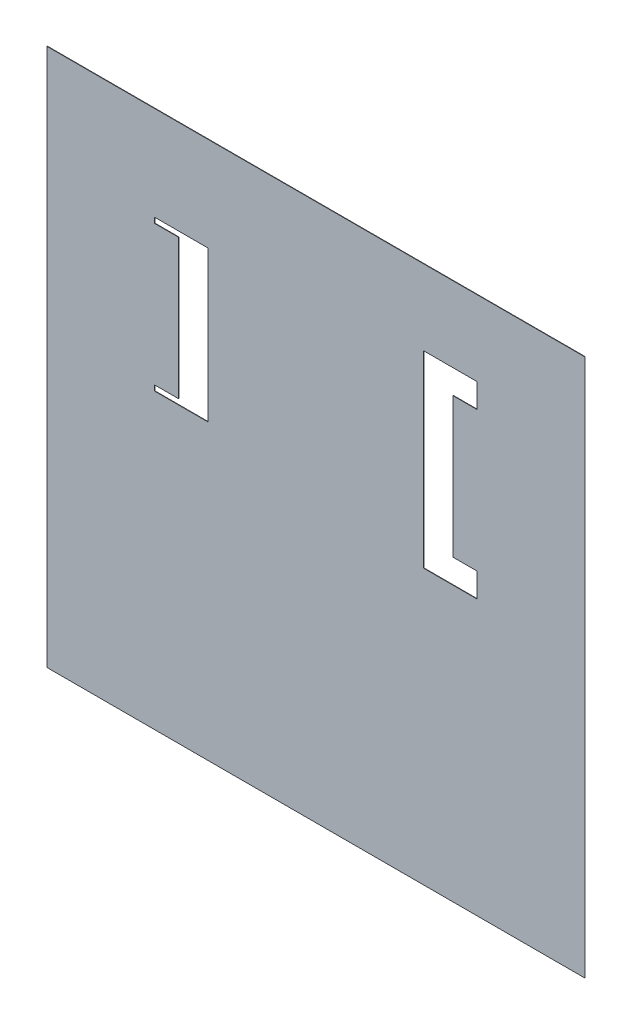
ISO-10303-21;
HEADER;
FILE_DESCRIPTION(('STEP AP214'),'2;1');
FILE_NAME('part.step','',(''),(''),'','','');
FILE_SCHEMA(('AUTOMOTIVE_DESIGN { 1 0 10303 214 1 1 1 1 }'));
ENDSEC;
DATA;
#1=APPLICATION_CONTEXT('core data for automotive mechanical design processes');
#2=APPLICATION_PROTOCOL_DEFINITION('international standard','automotive_design',2000,#1);
#3=PRODUCT_CONTEXT('',#1,'mechanical');
#4=PRODUCT('Part','Part','',(#3));
#5=PRODUCT_RELATED_PRODUCT_CATEGORY('part','',(#4));
#6=PRODUCT_DEFINITION_FORMATION('','',#4);
#7=PRODUCT_DEFINITION_CONTEXT('part definition',#1,'design');
#8=PRODUCT_DEFINITION('design','',#6,#7);
#9=PRODUCT_DEFINITION_SHAPE('','',#8);
#10=(LENGTH_UNIT() NAMED_UNIT(*) SI_UNIT(.MILLI.,.METRE.));
#11=(NAMED_UNIT(*) PLANE_ANGLE_UNIT() SI_UNIT($,.RADIAN.));
#12=(NAMED_UNIT(*) SI_UNIT($,.STERADIAN.) SOLID_ANGLE_UNIT());
#13=UNCERTAINTY_MEASURE_WITH_UNIT(LENGTH_MEASURE(1.E-05),#10,'distance_accuracy_value','');
#14=(GEOMETRIC_REPRESENTATION_CONTEXT(3) GLOBAL_UNCERTAINTY_ASSIGNED_CONTEXT((#13)) GLOBAL_UNIT_ASSIGNED_CONTEXT((#10,
#11,#12)) REPRESENTATION_CONTEXT('',''));
#15=CARTESIAN_POINT('',(0.,0.,0.));
#16=DIRECTION('',(0.,0.,1.));
#17=DIRECTION('',(1.,0.,0.));
#18=AXIS2_PLACEMENT_3D('',#15,#16,#17);
#19=CARTESIAN_POINT('',(0.,0.,0.02032));
#20=DIRECTION('',(1.,0.,0.));
#21=DIRECTION('',(0.,0.,-1.));
#22=AXIS2_PLACEMENT_3D('',#19,#20,#21);
#23=PLANE('',#22);
#24=DIRECTION('',(0.,-1.,0.));
#25=VECTOR('',#24,1.);
#26=CARTESIAN_POINT('',(0.,0.,0.));
#27=LINE('',#26,#25);
#28=CARTESIAN_POINT('',(0.,25.4,0.));
#29=VERTEX_POINT('',#28);
#30=CARTESIAN_POINT('',(0.,0.,0.));
#31=VERTEX_POINT('',#30);
#32=EDGE_CURVE('E314',#29,#31,#27,.T.);
#33=ORIENTED_EDGE('',*,*,#32,.T.);
#34=DIRECTION('',(0.,0.,-1.));
#35=VECTOR('',#34,1.);
#36=CARTESIAN_POINT('',(0.,0.,0.02032));
#37=LINE('',#36,#35);
#38=CARTESIAN_POINT('',(0.,0.,0.02032));
#39=VERTEX_POINT('',#38);
#40=EDGE_CURVE('E11',#39,#31,#37,.T.);
#41=ORIENTED_EDGE('',*,*,#40,.F.);
#42=DIRECTION('',(0.,-1.,0.));
#43=VECTOR('',#42,1.);
#44=CARTESIAN_POINT('',(0.,0.,0.02032));
#45=LINE('',#44,#43);
#46=CARTESIAN_POINT('',(0.,25.4,0.02032));
#47=VERTEX_POINT('',#46);
#48=EDGE_CURVE('E315',#47,#39,#45,.T.);
#49=ORIENTED_EDGE('',*,*,#48,.F.);
#50=DIRECTION('',(0.,0.,-1.));
#51=VECTOR('',#50,1.);
#52=CARTESIAN_POINT('',(0.,25.4,0.02032));
#53=LINE('',#52,#51);
#54=EDGE_CURVE('E325',#47,#29,#53,.T.);
#55=ORIENTED_EDGE('',*,*,#54,.T.);
#56=EDGE_LOOP('',(#33,#41,#49,#55));
#57=FACE_BOUND('',#56,.T.);
#58=ADVANCED_FACE('F33',(#57),#23,.F.);
#59=CARTESIAN_POINT('',(0.,0.,0.02032));
#60=DIRECTION('',(0.,1.,0.));
#61=DIRECTION('',(0.,0.,1.));
#62=AXIS2_PLACEMENT_3D('',#59,#60,#61);
#63=PLANE('',#62);
#64=DIRECTION('',(1.,0.,0.));
#65=VECTOR('',#64,1.);
#66=CARTESIAN_POINT('',(0.,0.,0.));
#67=LINE('',#66,#65);
#68=CARTESIAN_POINT('',(25.4,0.,0.));
#69=VERTEX_POINT('',#68);
#70=EDGE_CURVE('E328',#31,#69,#67,.T.);
#71=ORIENTED_EDGE('',*,*,#70,.T.);
#72=DIRECTION('',(0.,0.,-1.));
#73=VECTOR('',#72,1.);
#74=CARTESIAN_POINT('',(25.4,0.,0.02032));
#75=LINE('',#74,#73);
#76=CARTESIAN_POINT('',(25.4,0.,0.02032));
#77=VERTEX_POINT('',#76);
#78=EDGE_CURVE('E40',#77,#69,#75,.T.);
#79=ORIENTED_EDGE('',*,*,#78,.F.);
#80=DIRECTION('',(1.,0.,0.));
#81=VECTOR('',#80,1.);
#82=CARTESIAN_POINT('',(0.,0.,0.02032));
#83=LINE('',#82,#81);
#84=EDGE_CURVE('E318',#39,#77,#83,.T.);
#85=ORIENTED_EDGE('',*,*,#84,.F.);
#86=ORIENTED_EDGE('',*,*,#40,.T.);
#87=EDGE_LOOP('',(#71,#79,#85,#86));
#88=FACE_BOUND('',#87,.T.);
#89=ADVANCED_FACE('F357',(#88),#63,.F.);
#90=CARTESIAN_POINT('',(25.4,0.,0.02032));
#91=DIRECTION('',(-1.,0.,0.));
#92=DIRECTION('',(0.,0.,1.));
#93=AXIS2_PLACEMENT_3D('',#90,#91,#92);
#94=PLANE('',#93);
#95=DIRECTION('',(0.,1.,0.));
#96=VECTOR('',#95,1.);
#97=CARTESIAN_POINT('',(25.4,0.,0.));
#98=LINE('',#97,#96);
#99=CARTESIAN_POINT('',(25.4,25.4,0.));
#100=VERTEX_POINT('',#99);
#101=EDGE_CURVE('E330',#69,#100,#98,.T.);
#102=ORIENTED_EDGE('',*,*,#101,.T.);
#103=DIRECTION('',(0.,0.,-1.));
#104=VECTOR('',#103,1.);
#105=CARTESIAN_POINT('',(25.4,25.4,0.02032));
#106=LINE('',#105,#104);
#107=CARTESIAN_POINT('',(25.4,25.4,0.02032));
#108=VERTEX_POINT('',#107);
#109=EDGE_CURVE('E335',#108,#100,#106,.T.);
#110=ORIENTED_EDGE('',*,*,#109,.F.);
#111=DIRECTION('',(0.,1.,0.));
#112=VECTOR('',#111,1.);
#113=CARTESIAN_POINT('',(25.4,0.,0.02032));
#114=LINE('',#113,#112);
#115=EDGE_CURVE('E321',#77,#108,#114,.T.);
#116=ORIENTED_EDGE('',*,*,#115,.F.);
#117=ORIENTED_EDGE('',*,*,#78,.T.);
#118=EDGE_LOOP('',(#102,#110,#116,#117));
#119=FACE_BOUND('',#118,.T.);
#120=ADVANCED_FACE('F342',(#119),#94,.F.);
#121=CARTESIAN_POINT('',(0.,25.4,0.02032));
#122=DIRECTION('',(0.,-1.,0.));
#123=DIRECTION('',(0.,0.,-1.));
#124=AXIS2_PLACEMENT_3D('',#121,#122,#123);
#125=PLANE('',#124);
#126=DIRECTION('',(-1.,0.,0.));
#127=VECTOR('',#126,1.);
#128=CARTESIAN_POINT('',(0.,25.4,0.));
#129=LINE('',#128,#127);
#130=EDGE_CURVE('E319',#100,#29,#129,.T.);
#131=ORIENTED_EDGE('',*,*,#130,.T.);
#132=ORIENTED_EDGE('',*,*,#54,.F.);
#133=DIRECTION('',(-1.,0.,0.));
#134=VECTOR('',#133,1.);
#135=CARTESIAN_POINT('',(0.,25.4,0.02032));
#136=LINE('',#135,#134);
#137=EDGE_CURVE('E323',#108,#47,#136,.T.);
#138=ORIENTED_EDGE('',*,*,#137,.F.);
#139=ORIENTED_EDGE('',*,*,#109,.T.);
#140=EDGE_LOOP('',(#131,#132,#138,#139));
#141=FACE_BOUND('',#140,.T.);
#142=ADVANCED_FACE('F350',(#141),#125,.F.);
#143=CARTESIAN_POINT('',(0.,0.,0.02032));
#144=DIRECTION('',(0.,0.,-1.));
#145=DIRECTION('',(-1.,0.,0.));
#146=AXIS2_PLACEMENT_3D('',#143,#144,#145);
#147=PLANE('',#146);
#148=DIRECTION('',(-1.,0.,0.));
#149=VECTOR('',#148,1.);
#150=CARTESIAN_POINT('',(0.,12.954,0.02032));
#151=LINE('',#150,#149);
#152=CARTESIAN_POINT('',(20.32,12.954,0.02032));
#153=VERTEX_POINT('',#152);
#154=CARTESIAN_POINT('',(17.78,12.954,0.02032));
#155=VERTEX_POINT('',#154);
#156=EDGE_CURVE('E206',#153,#155,#151,.T.);
#157=ORIENTED_EDGE('',*,*,#156,.T.);
#158=DIRECTION('',(0.,1.,0.));
#159=VECTOR('',#158,1.);
#160=CARTESIAN_POINT('',(17.78,0.,0.02032));
#161=LINE('',#160,#159);
#162=CARTESIAN_POINT('',(17.78,21.844,0.02032));
#163=VERTEX_POINT('',#162);
#164=EDGE_CURVE('E175',#155,#163,#161,.T.);
#165=ORIENTED_EDGE('',*,*,#164,.T.);
#166=DIRECTION('',(1.,0.,0.));
#167=VECTOR('',#166,1.);
#168=CARTESIAN_POINT('',(0.,21.844,0.02032));
#169=LINE('',#168,#167);
#170=CARTESIAN_POINT('',(20.32,21.844,0.02032));
#171=VERTEX_POINT('',#170);
#172=EDGE_CURVE('E239',#163,#171,#169,.T.);
#173=ORIENTED_EDGE('',*,*,#172,.T.);
#174=DIRECTION('',(0.,-1.,0.));
#175=VECTOR('',#174,1.);
#176=CARTESIAN_POINT('',(20.3200000000001,1.2335811384724E-13,0.02032));
#177=LINE('',#176,#175);
#178=CARTESIAN_POINT('',(20.32,20.701,0.02032));
#179=VERTEX_POINT('',#178);
#180=EDGE_CURVE('E236',#171,#179,#177,.T.);
#181=ORIENTED_EDGE('',*,*,#180,.T.);
#182=DIRECTION('',(-1.,0.,0.));
#183=VECTOR('',#182,1.);
#184=CARTESIAN_POINT('',(0.,20.701,0.02032));
#185=LINE('',#184,#183);
#186=CARTESIAN_POINT('',(19.177,20.701,0.02032));
#187=VERTEX_POINT('',#186);
#188=EDGE_CURVE('E233',#179,#187,#185,.T.);
#189=ORIENTED_EDGE('',*,*,#188,.T.);
#190=DIRECTION('',(0.,-1.,0.));
#191=VECTOR('',#190,1.);
#192=CARTESIAN_POINT('',(19.177,0.,0.02032));
#193=LINE('',#192,#191);
#194=CARTESIAN_POINT('',(19.177,14.097,0.02032));
#195=VERTEX_POINT('',#194);
#196=EDGE_CURVE('E230',#187,#195,#193,.T.);
#197=ORIENTED_EDGE('',*,*,#196,.T.);
#198=DIRECTION('',(1.,0.,0.));
#199=VECTOR('',#198,1.);
#200=CARTESIAN_POINT('',(0.,14.097,0.02032));
#201=LINE('',#200,#199);
#202=CARTESIAN_POINT('',(20.32,14.097,0.02032));
#203=VERTEX_POINT('',#202);
#204=EDGE_CURVE('E227',#195,#203,#201,.T.);
#205=ORIENTED_EDGE('',*,*,#204,.T.);
#206=DIRECTION('',(0.,-1.,0.));
#207=VECTOR('',#206,1.);
#208=CARTESIAN_POINT('',(20.3199999999999,-1.85037170770858E-13,0.02032));
#209=LINE('',#208,#207);
#210=EDGE_CURVE('E224',#203,#153,#209,.T.);
#211=ORIENTED_EDGE('',*,*,#210,.T.);
#212=EDGE_LOOP('',(#157,#165,#173,#181,#189,#197,#205,#211));
#213=FACE_BOUND('',#212,.T.);
#214=DIRECTION('',(-1.,0.,0.));
#215=VECTOR('',#214,1.);
#216=CARTESIAN_POINT('',(0.,20.701,0.02032));
#217=LINE('',#216,#215);
#218=CARTESIAN_POINT('',(6.223,20.701,0.02032));
#219=VERTEX_POINT('',#218);
#220=CARTESIAN_POINT('',(5.08,20.701,0.02032));
#221=VERTEX_POINT('',#220);
#222=EDGE_CURVE('E271',#219,#221,#217,.T.);
#223=ORIENTED_EDGE('',*,*,#222,.T.);
#224=DIRECTION('',(0.,1.,0.));
#225=VECTOR('',#224,1.);
#226=CARTESIAN_POINT('',(5.08000000000014,0.,0.02032));
#227=LINE('',#226,#225);
#228=CARTESIAN_POINT('',(5.08,20.955,0.02032));
#229=VERTEX_POINT('',#228);
#230=EDGE_CURVE('E311',#221,#229,#227,.T.);
#231=ORIENTED_EDGE('',*,*,#230,.T.);
#232=DIRECTION('',(1.,0.,0.));
#233=VECTOR('',#232,1.);
#234=CARTESIAN_POINT('',(0.,20.955,0.02032));
#235=LINE('',#234,#233);
#236=CARTESIAN_POINT('',(7.62,20.955,0.02032));
#237=VERTEX_POINT('',#236);
#238=EDGE_CURVE('E308',#229,#237,#235,.T.);
#239=ORIENTED_EDGE('',*,*,#238,.T.);
#240=DIRECTION('',(0.,-1.,0.));
#241=VECTOR('',#240,1.);
#242=CARTESIAN_POINT('',(7.62,0.,0.02032));
#243=LINE('',#242,#241);
#244=CARTESIAN_POINT('',(7.62,13.843,0.02032));
#245=VERTEX_POINT('',#244);
#246=EDGE_CURVE('E305',#237,#245,#243,.T.);
#247=ORIENTED_EDGE('',*,*,#246,.T.);
#248=DIRECTION('',(-1.,0.,0.));
#249=VECTOR('',#248,1.);
#250=CARTESIAN_POINT('',(0.,13.843,0.02032));
#251=LINE('',#250,#249);
#252=CARTESIAN_POINT('',(5.08,13.843,0.02032));
#253=VERTEX_POINT('',#252);
#254=EDGE_CURVE('E302',#245,#253,#251,.T.);
#255=ORIENTED_EDGE('',*,*,#254,.T.);
#256=DIRECTION('',(0.,1.,0.));
#257=VECTOR('',#256,1.);
#258=CARTESIAN_POINT('',(5.08,0.,0.02032));
#259=LINE('',#258,#257);
#260=CARTESIAN_POINT('',(5.08,14.097,0.02032));
#261=VERTEX_POINT('',#260);
#262=EDGE_CURVE('E299',#253,#261,#259,.T.);
#263=ORIENTED_EDGE('',*,*,#262,.T.);
#264=DIRECTION('',(1.,0.,0.));
#265=VECTOR('',#264,1.);
#266=CARTESIAN_POINT('',(0.,14.097,0.02032));
#267=LINE('',#266,#265);
#268=CARTESIAN_POINT('',(6.223,14.097,0.02032));
#269=VERTEX_POINT('',#268);
#270=EDGE_CURVE('E296',#261,#269,#267,.T.);
#271=ORIENTED_EDGE('',*,*,#270,.T.);
#272=DIRECTION('',(0.,1.,0.));
#273=VECTOR('',#272,1.);
#274=CARTESIAN_POINT('',(6.223,0.,0.02032));
#275=LINE('',#274,#273);
#276=EDGE_CURVE('E293',#269,#219,#275,.T.);
#277=ORIENTED_EDGE('',*,*,#276,.T.);
#278=EDGE_LOOP('',(#223,#231,#239,#247,#255,#263,#271,#277));
#279=FACE_BOUND('',#278,.T.);
#280=ORIENTED_EDGE('',*,*,#48,.T.);
#281=ORIENTED_EDGE('',*,*,#84,.T.);
#282=ORIENTED_EDGE('',*,*,#115,.T.);
#283=ORIENTED_EDGE('',*,*,#137,.T.);
#284=EDGE_LOOP('',(#280,#281,#282,#283));
#285=FACE_BOUND('',#284,.T.);
#286=ADVANCED_FACE('F356',(#213,#279,#285),#147,.F.);
#287=CARTESIAN_POINT('',(0.,0.,0.));
#288=DIRECTION('',(0.,0.,-1.));
#289=DIRECTION('',(-1.,0.,0.));
#290=AXIS2_PLACEMENT_3D('',#287,#288,#289);
#291=PLANE('',#290);
#292=DIRECTION('',(0.,-1.,0.));
#293=VECTOR('',#292,1.);
#294=CARTESIAN_POINT('',(17.78,21.844,0.));
#295=LINE('',#294,#293);
#296=CARTESIAN_POINT('',(17.78,21.844,0.));
#297=VERTEX_POINT('',#296);
#298=CARTESIAN_POINT('',(17.78,12.954,0.));
#299=VERTEX_POINT('',#298);
#300=EDGE_CURVE('E172',#297,#299,#295,.T.);
#301=ORIENTED_EDGE('',*,*,#300,.T.);
#302=DIRECTION('',(1.,0.,0.));
#303=VECTOR('',#302,1.);
#304=CARTESIAN_POINT('',(17.78,12.954,0.));
#305=LINE('',#304,#303);
#306=CARTESIAN_POINT('',(20.32,12.954,0.));
#307=VERTEX_POINT('',#306);
#308=EDGE_CURVE('E181',#299,#307,#305,.T.);
#309=ORIENTED_EDGE('',*,*,#308,.T.);
#310=DIRECTION('',(0.,1.,0.));
#311=VECTOR('',#310,1.);
#312=CARTESIAN_POINT('',(20.32,14.097,0.));
#313=LINE('',#312,#311);
#314=CARTESIAN_POINT('',(20.32,14.097,0.));
#315=VERTEX_POINT('',#314);
#316=EDGE_CURVE('E55',#307,#315,#313,.T.);
#317=ORIENTED_EDGE('',*,*,#316,.T.);
#318=DIRECTION('',(-1.,0.,0.));
#319=VECTOR('',#318,1.);
#320=CARTESIAN_POINT('',(20.32,14.097,0.));
#321=LINE('',#320,#319);
#322=CARTESIAN_POINT('',(19.177,14.097,0.));
#323=VERTEX_POINT('',#322);
#324=EDGE_CURVE('E192',#315,#323,#321,.T.);
#325=ORIENTED_EDGE('',*,*,#324,.T.);
#326=DIRECTION('',(0.,1.,0.));
#327=VECTOR('',#326,1.);
#328=CARTESIAN_POINT('',(19.177,14.097,0.));
#329=LINE('',#328,#327);
#330=CARTESIAN_POINT('',(19.177,20.701,0.));
#331=VERTEX_POINT('',#330);
#332=EDGE_CURVE('E195',#323,#331,#329,.T.);
#333=ORIENTED_EDGE('',*,*,#332,.T.);
#334=DIRECTION('',(1.,0.,0.));
#335=VECTOR('',#334,1.);
#336=CARTESIAN_POINT('',(20.32,20.701,0.));
#337=LINE('',#336,#335);
#338=CARTESIAN_POINT('',(20.32,20.701,0.));
#339=VERTEX_POINT('',#338);
#340=EDGE_CURVE('E198',#331,#339,#337,.T.);
#341=ORIENTED_EDGE('',*,*,#340,.T.);
#342=DIRECTION('',(0.,1.,0.));
#343=VECTOR('',#342,1.);
#344=CARTESIAN_POINT('',(20.32,21.844,0.));
#345=LINE('',#344,#343);
#346=CARTESIAN_POINT('',(20.32,21.844,0.));
#347=VERTEX_POINT('',#346);
#348=EDGE_CURVE('E201',#339,#347,#345,.T.);
#349=ORIENTED_EDGE('',*,*,#348,.T.);
#350=DIRECTION('',(-1.,0.,0.));
#351=VECTOR('',#350,1.);
#352=CARTESIAN_POINT('',(17.78,21.844,0.));
#353=LINE('',#352,#351);
#354=EDGE_CURVE('E178',#347,#297,#353,.T.);
#355=ORIENTED_EDGE('',*,*,#354,.T.);
#356=EDGE_LOOP('',(#301,#309,#317,#325,#333,#341,#349,#355));
#357=FACE_BOUND('',#356,.T.);
#358=DIRECTION('',(0.,-1.,0.));
#359=VECTOR('',#358,1.);
#360=CARTESIAN_POINT('',(5.08,20.955,0.));
#361=LINE('',#360,#359);
#362=CARTESIAN_POINT('',(5.08,20.955,0.));
#363=VERTEX_POINT('',#362);
#364=CARTESIAN_POINT('',(5.08,20.701,0.));
#365=VERTEX_POINT('',#364);
#366=EDGE_CURVE('E243',#363,#365,#361,.T.);
#367=ORIENTED_EDGE('',*,*,#366,.T.);
#368=DIRECTION('',(1.,0.,0.));
#369=VECTOR('',#368,1.);
#370=CARTESIAN_POINT('',(5.08,20.701,0.));
#371=LINE('',#370,#369);
#372=CARTESIAN_POINT('',(6.223,20.701,0.));
#373=VERTEX_POINT('',#372);
#374=EDGE_CURVE('E246',#365,#373,#371,.T.);
#375=ORIENTED_EDGE('',*,*,#374,.T.);
#376=DIRECTION('',(0.,-1.,0.));
#377=VECTOR('',#376,1.);
#378=CARTESIAN_POINT('',(6.223,14.097,0.));
#379=LINE('',#378,#377);
#380=CARTESIAN_POINT('',(6.223,14.097,0.));
#381=VERTEX_POINT('',#380);
#382=EDGE_CURVE('E249',#373,#381,#379,.T.);
#383=ORIENTED_EDGE('',*,*,#382,.T.);
#384=DIRECTION('',(-1.,0.,0.));
#385=VECTOR('',#384,1.);
#386=CARTESIAN_POINT('',(5.08,14.097,0.));
#387=LINE('',#386,#385);
#388=CARTESIAN_POINT('',(5.08,14.097,0.));
#389=VERTEX_POINT('',#388);
#390=EDGE_CURVE('E252',#381,#389,#387,.T.);
#391=ORIENTED_EDGE('',*,*,#390,.T.);
#392=DIRECTION('',(0.,-1.,0.));
#393=VECTOR('',#392,1.);
#394=CARTESIAN_POINT('',(5.08,14.097,0.));
#395=LINE('',#394,#393);
#396=CARTESIAN_POINT('',(5.08,13.843,0.));
#397=VERTEX_POINT('',#396);
#398=EDGE_CURVE('E255',#389,#397,#395,.T.);
#399=ORIENTED_EDGE('',*,*,#398,.T.);
#400=DIRECTION('',(1.,0.,0.));
#401=VECTOR('',#400,1.);
#402=CARTESIAN_POINT('',(5.08,13.843,0.));
#403=LINE('',#402,#401);
#404=CARTESIAN_POINT('',(7.62,13.843,0.));
#405=VERTEX_POINT('',#404);
#406=EDGE_CURVE('E258',#397,#405,#403,.T.);
#407=ORIENTED_EDGE('',*,*,#406,.T.);
#408=DIRECTION('',(0.,1.,0.));
#409=VECTOR('',#408,1.);
#410=CARTESIAN_POINT('',(7.62,20.955,0.));
#411=LINE('',#410,#409);
#412=CARTESIAN_POINT('',(7.62,20.955,0.));
#413=VERTEX_POINT('',#412);
#414=EDGE_CURVE('E261',#405,#413,#411,.T.);
#415=ORIENTED_EDGE('',*,*,#414,.T.);
#416=DIRECTION('',(-1.,0.,0.));
#417=VECTOR('',#416,1.);
#418=CARTESIAN_POINT('',(5.08,20.955,0.));
#419=LINE('',#418,#417);
#420=EDGE_CURVE('E264',#413,#363,#419,.T.);
#421=ORIENTED_EDGE('',*,*,#420,.T.);
#422=EDGE_LOOP('',(#367,#375,#383,#391,#399,#407,#415,#421));
#423=FACE_BOUND('',#422,.T.);
#424=ORIENTED_EDGE('',*,*,#32,.F.);
#425=ORIENTED_EDGE('',*,*,#130,.F.);
#426=ORIENTED_EDGE('',*,*,#101,.F.);
#427=ORIENTED_EDGE('',*,*,#70,.F.);
#428=EDGE_LOOP('',(#424,#425,#426,#427));
#429=FACE_BOUND('',#428,.T.);
#430=ADVANCED_FACE('F185',(#357,#423,#429),#291,.T.);
#431=CARTESIAN_POINT('',(5.08,20.955,0.));
#432=DIRECTION('',(-1.,0.,0.));
#433=DIRECTION('',(0.,-1.,0.));
#434=AXIS2_PLACEMENT_3D('',#431,#432,#433);
#435=PLANE('',#434);
#436=DIRECTION('',(0.,0.,1.));
#437=VECTOR('',#436,1.);
#438=CARTESIAN_POINT('',(5.08,20.701,0.));
#439=LINE('',#438,#437);
#440=EDGE_CURVE('E267',#365,#221,#439,.T.);
#441=ORIENTED_EDGE('',*,*,#440,.F.);
#442=ORIENTED_EDGE('',*,*,#366,.F.);
#443=DIRECTION('',(0.,0.,1.));
#444=VECTOR('',#443,1.);
#445=CARTESIAN_POINT('',(5.08,20.955,0.));
#446=LINE('',#445,#444);
#447=EDGE_CURVE('E268',#363,#229,#446,.T.);
#448=ORIENTED_EDGE('',*,*,#447,.T.);
#449=ORIENTED_EDGE('',*,*,#230,.F.);
#450=EDGE_LOOP('',(#441,#442,#448,#449));
#451=FACE_BOUND('',#450,.T.);
#452=ADVANCED_FACE('F369',(#451),#435,.F.);
#453=CARTESIAN_POINT('',(5.08,20.955,0.));
#454=DIRECTION('',(0.,1.,0.));
#455=DIRECTION('',(0.,0.,1.));
#456=AXIS2_PLACEMENT_3D('',#453,#454,#455);
#457=PLANE('',#456);
#458=ORIENTED_EDGE('',*,*,#447,.F.);
#459=ORIENTED_EDGE('',*,*,#420,.F.);
#460=DIRECTION('',(0.,0.,1.));
#461=VECTOR('',#460,1.);
#462=CARTESIAN_POINT('',(7.62,20.955,0.));
#463=LINE('',#462,#461);
#464=EDGE_CURVE('E272',#413,#237,#463,.T.);
#465=ORIENTED_EDGE('',*,*,#464,.T.);
#466=ORIENTED_EDGE('',*,*,#238,.F.);
#467=EDGE_LOOP('',(#458,#459,#465,#466));
#468=FACE_BOUND('',#467,.T.);
#469=ADVANCED_FACE('F375',(#468),#457,.F.);
#470=CARTESIAN_POINT('',(7.62,20.955,0.));
#471=DIRECTION('',(1.,0.,0.));
#472=DIRECTION('',(0.,0.,-1.));
#473=AXIS2_PLACEMENT_3D('',#470,#471,#472);
#474=PLANE('',#473);
#475=ORIENTED_EDGE('',*,*,#464,.F.);
#476=ORIENTED_EDGE('',*,*,#414,.F.);
#477=DIRECTION('',(0.,0.,1.));
#478=VECTOR('',#477,1.);
#479=CARTESIAN_POINT('',(7.62,13.843,0.));
#480=LINE('',#479,#478);
#481=EDGE_CURVE('E275',#405,#245,#480,.T.);
#482=ORIENTED_EDGE('',*,*,#481,.T.);
#483=ORIENTED_EDGE('',*,*,#246,.F.);
#484=EDGE_LOOP('',(#475,#476,#482,#483));
#485=FACE_BOUND('',#484,.T.);
#486=ADVANCED_FACE('F396',(#485),#474,.F.);
#487=CARTESIAN_POINT('',(5.08,13.843,0.));
#488=DIRECTION('',(0.,-1.,0.));
#489=DIRECTION('',(0.,0.,-1.));
#490=AXIS2_PLACEMENT_3D('',#487,#488,#489);
#491=PLANE('',#490);
#492=ORIENTED_EDGE('',*,*,#481,.F.);
#493=ORIENTED_EDGE('',*,*,#406,.F.);
#494=DIRECTION('',(0.,0.,1.));
#495=VECTOR('',#494,1.);
#496=CARTESIAN_POINT('',(5.08,13.843,0.));
#497=LINE('',#496,#495);
#498=EDGE_CURVE('E278',#397,#253,#497,.T.);
#499=ORIENTED_EDGE('',*,*,#498,.T.);
#500=ORIENTED_EDGE('',*,*,#254,.F.);
#501=EDGE_LOOP('',(#492,#493,#499,#500));
#502=FACE_BOUND('',#501,.T.);
#503=ADVANCED_FACE('F392',(#502),#491,.F.);
#504=CARTESIAN_POINT('',(5.08,14.097,0.));
#505=DIRECTION('',(-1.,0.,0.));
#506=DIRECTION('',(0.,0.,1.));
#507=AXIS2_PLACEMENT_3D('',#504,#505,#506);
#508=PLANE('',#507);
#509=ORIENTED_EDGE('',*,*,#498,.F.);
#510=ORIENTED_EDGE('',*,*,#398,.F.);
#511=DIRECTION('',(0.,0.,1.));
#512=VECTOR('',#511,1.);
#513=CARTESIAN_POINT('',(5.08,14.097,0.));
#514=LINE('',#513,#512);
#515=EDGE_CURVE('E281',#389,#261,#514,.T.);
#516=ORIENTED_EDGE('',*,*,#515,.T.);
#517=ORIENTED_EDGE('',*,*,#262,.F.);
#518=EDGE_LOOP('',(#509,#510,#516,#517));
#519=FACE_BOUND('',#518,.T.);
#520=ADVANCED_FACE('F388',(#519),#508,.F.);
#521=CARTESIAN_POINT('',(5.08,14.097,0.));
#522=DIRECTION('',(0.,1.,0.));
#523=DIRECTION('',(0.,0.,1.));
#524=AXIS2_PLACEMENT_3D('',#521,#522,#523);
#525=PLANE('',#524);
#526=ORIENTED_EDGE('',*,*,#515,.F.);
#527=ORIENTED_EDGE('',*,*,#390,.F.);
#528=DIRECTION('',(0.,0.,1.));
#529=VECTOR('',#528,1.);
#530=CARTESIAN_POINT('',(6.223,14.097,0.));
#531=LINE('',#530,#529);
#532=EDGE_CURVE('E284',#381,#269,#531,.T.);
#533=ORIENTED_EDGE('',*,*,#532,.T.);
#534=ORIENTED_EDGE('',*,*,#270,.F.);
#535=EDGE_LOOP('',(#526,#527,#533,#534));
#536=FACE_BOUND('',#535,.T.);
#537=ADVANCED_FACE('F384',(#536),#525,.F.);
#538=CARTESIAN_POINT('',(6.223,14.097,0.));
#539=DIRECTION('',(-1.,0.,0.));
#540=DIRECTION('',(0.,0.,1.));
#541=AXIS2_PLACEMENT_3D('',#538,#539,#540);
#542=PLANE('',#541);
#543=ORIENTED_EDGE('',*,*,#532,.F.);
#544=ORIENTED_EDGE('',*,*,#382,.F.);
#545=DIRECTION('',(0.,0.,1.));
#546=VECTOR('',#545,1.);
#547=CARTESIAN_POINT('',(6.223,20.701,0.));
#548=LINE('',#547,#546);
#549=EDGE_CURVE('E287',#373,#219,#548,.T.);
#550=ORIENTED_EDGE('',*,*,#549,.T.);
#551=ORIENTED_EDGE('',*,*,#276,.F.);
#552=EDGE_LOOP('',(#543,#544,#550,#551));
#553=FACE_BOUND('',#552,.T.);
#554=ADVANCED_FACE('F380',(#553),#542,.F.);
#555=CARTESIAN_POINT('',(5.08,20.701,0.));
#556=DIRECTION('',(0.,-1.,0.));
#557=DIRECTION('',(0.,0.,-1.));
#558=AXIS2_PLACEMENT_3D('',#555,#556,#557);
#559=PLANE('',#558);
#560=ORIENTED_EDGE('',*,*,#549,.F.);
#561=ORIENTED_EDGE('',*,*,#374,.F.);
#562=ORIENTED_EDGE('',*,*,#440,.T.);
#563=ORIENTED_EDGE('',*,*,#222,.F.);
#564=EDGE_LOOP('',(#560,#561,#562,#563));
#565=FACE_BOUND('',#564,.T.);
#566=ADVANCED_FACE('F377',(#565),#559,.F.);
#567=CARTESIAN_POINT('',(17.78,21.844,0.));
#568=DIRECTION('',(-1.,0.,0.));
#569=DIRECTION('',(0.,0.,1.));
#570=AXIS2_PLACEMENT_3D('',#567,#568,#569);
#571=PLANE('',#570);
#572=DIRECTION('',(0.,0.,1.));
#573=VECTOR('',#572,1.);
#574=CARTESIAN_POINT('',(17.78,12.954,0.));
#575=LINE('',#574,#573);
#576=EDGE_CURVE('E47',#299,#155,#575,.T.);
#577=ORIENTED_EDGE('',*,*,#576,.F.);
#578=ORIENTED_EDGE('',*,*,#300,.F.);
#579=DIRECTION('',(0.,0.,1.));
#580=VECTOR('',#579,1.);
#581=CARTESIAN_POINT('',(17.78,21.844,0.));
#582=LINE('',#581,#580);
#583=EDGE_CURVE('E204',#297,#163,#582,.T.);
#584=ORIENTED_EDGE('',*,*,#583,.T.);
#585=ORIENTED_EDGE('',*,*,#164,.F.);
#586=EDGE_LOOP('',(#577,#578,#584,#585));
#587=FACE_BOUND('',#586,.T.);
#588=ADVANCED_FACE('F169',(#587),#571,.F.);
#589=CARTESIAN_POINT('',(17.78,21.844,0.));
#590=DIRECTION('',(0.,1.,0.));
#591=DIRECTION('',(0.,0.,1.));
#592=AXIS2_PLACEMENT_3D('',#589,#590,#591);
#593=PLANE('',#592);
#594=ORIENTED_EDGE('',*,*,#583,.F.);
#595=ORIENTED_EDGE('',*,*,#354,.F.);
#596=DIRECTION('',(0.,0.,1.));
#597=VECTOR('',#596,1.);
#598=CARTESIAN_POINT('',(20.32,21.844,0.));
#599=LINE('',#598,#597);
#600=EDGE_CURVE('E207',#347,#171,#599,.T.);
#601=ORIENTED_EDGE('',*,*,#600,.T.);
#602=ORIENTED_EDGE('',*,*,#172,.F.);
#603=EDGE_LOOP('',(#594,#595,#601,#602));
#604=FACE_BOUND('',#603,.T.);
#605=ADVANCED_FACE('F406',(#604),#593,.F.);
#606=CARTESIAN_POINT('',(20.32,21.844,0.));
#607=DIRECTION('',(1.,0.,0.));
#608=DIRECTION('',(0.,1.,0.));
#609=AXIS2_PLACEMENT_3D('',#606,#607,#608);
#610=PLANE('',#609);
#611=ORIENTED_EDGE('',*,*,#600,.F.);
#612=ORIENTED_EDGE('',*,*,#348,.F.);
#613=DIRECTION('',(0.,0.,1.));
#614=VECTOR('',#613,1.);
#615=CARTESIAN_POINT('',(20.32,20.701,0.));
#616=LINE('',#615,#614);
#617=EDGE_CURVE('E210',#339,#179,#616,.T.);
#618=ORIENTED_EDGE('',*,*,#617,.T.);
#619=ORIENTED_EDGE('',*,*,#180,.F.);
#620=EDGE_LOOP('',(#611,#612,#618,#619));
#621=FACE_BOUND('',#620,.T.);
#622=ADVANCED_FACE('F423',(#621),#610,.F.);
#623=CARTESIAN_POINT('',(20.32,20.701,0.));
#624=DIRECTION('',(0.,-1.,0.));
#625=DIRECTION('',(0.,0.,-1.));
#626=AXIS2_PLACEMENT_3D('',#623,#624,#625);
#627=PLANE('',#626);
#628=ORIENTED_EDGE('',*,*,#617,.F.);
#629=ORIENTED_EDGE('',*,*,#340,.F.);
#630=DIRECTION('',(0.,0.,1.));
#631=VECTOR('',#630,1.);
#632=CARTESIAN_POINT('',(19.177,20.701,0.));
#633=LINE('',#632,#631);
#634=EDGE_CURVE('E213',#331,#187,#633,.T.);
#635=ORIENTED_EDGE('',*,*,#634,.T.);
#636=ORIENTED_EDGE('',*,*,#188,.F.);
#637=EDGE_LOOP('',(#628,#629,#635,#636));
#638=FACE_BOUND('',#637,.T.);
#639=ADVANCED_FACE('F419',(#638),#627,.F.);
#640=CARTESIAN_POINT('',(19.177,14.097,0.));
#641=DIRECTION('',(1.,0.,0.));
#642=DIRECTION('',(0.,0.,-1.));
#643=AXIS2_PLACEMENT_3D('',#640,#641,#642);
#644=PLANE('',#643);
#645=ORIENTED_EDGE('',*,*,#634,.F.);
#646=ORIENTED_EDGE('',*,*,#332,.F.);
#647=DIRECTION('',(0.,0.,1.));
#648=VECTOR('',#647,1.);
#649=CARTESIAN_POINT('',(19.177,14.097,0.));
#650=LINE('',#649,#648);
#651=EDGE_CURVE('E216',#323,#195,#650,.T.);
#652=ORIENTED_EDGE('',*,*,#651,.T.);
#653=ORIENTED_EDGE('',*,*,#196,.F.);
#654=EDGE_LOOP('',(#645,#646,#652,#653));
#655=FACE_BOUND('',#654,.T.);
#656=ADVANCED_FACE('F415',(#655),#644,.F.);
#657=CARTESIAN_POINT('',(20.32,14.097,0.));
#658=DIRECTION('',(0.,1.,0.));
#659=DIRECTION('',(-1.,0.,0.));
#660=AXIS2_PLACEMENT_3D('',#657,#658,#659);
#661=PLANE('',#660);
#662=ORIENTED_EDGE('',*,*,#651,.F.);
#663=ORIENTED_EDGE('',*,*,#324,.F.);
#664=DIRECTION('',(0.,0.,1.));
#665=VECTOR('',#664,1.);
#666=CARTESIAN_POINT('',(20.32,14.097,0.));
#667=LINE('',#666,#665);
#668=EDGE_CURVE('E219',#315,#203,#667,.T.);
#669=ORIENTED_EDGE('',*,*,#668,.T.);
#670=ORIENTED_EDGE('',*,*,#204,.F.);
#671=EDGE_LOOP('',(#662,#663,#669,#670));
#672=FACE_BOUND('',#671,.T.);
#673=ADVANCED_FACE('F412',(#672),#661,.F.);
#674=CARTESIAN_POINT('',(20.32,14.097,0.));
#675=DIRECTION('',(1.,0.,0.));
#676=DIRECTION('',(0.,1.,0.));
#677=AXIS2_PLACEMENT_3D('',#674,#675,#676);
#678=PLANE('',#677);
#679=ORIENTED_EDGE('',*,*,#668,.F.);
#680=ORIENTED_EDGE('',*,*,#316,.F.);
#681=DIRECTION('',(0.,0.,1.));
#682=VECTOR('',#681,1.);
#683=CARTESIAN_POINT('',(20.32,12.954,0.));
#684=LINE('',#683,#682);
#685=EDGE_CURVE('E177',#307,#153,#684,.T.);
#686=ORIENTED_EDGE('',*,*,#685,.T.);
#687=ORIENTED_EDGE('',*,*,#210,.F.);
#688=EDGE_LOOP('',(#679,#680,#686,#687));
#689=FACE_BOUND('',#688,.T.);
#690=ADVANCED_FACE('F409',(#689),#678,.F.);
#691=CARTESIAN_POINT('',(17.78,12.954,0.));
#692=DIRECTION('',(0.,-1.,0.));
#693=DIRECTION('',(0.,0.,-1.));
#694=AXIS2_PLACEMENT_3D('',#691,#692,#693);
#695=PLANE('',#694);
#696=ORIENTED_EDGE('',*,*,#685,.F.);
#697=ORIENTED_EDGE('',*,*,#308,.F.);
#698=ORIENTED_EDGE('',*,*,#576,.T.);
#699=ORIENTED_EDGE('',*,*,#156,.F.);
#700=EDGE_LOOP('',(#696,#697,#698,#699));
#701=FACE_BOUND('',#700,.T.);
#702=ADVANCED_FACE('F182',(#701),#695,.F.);
#703=CLOSED_SHELL('',(#58,#89,#120,#142,#286,#430,#452,#469,#486,#503,#520,#537,#554,#566,#588,
#605,#622,#639,#656,#673,#690,#702));
#704=MANIFOLD_SOLID_BREP('B2',#703);
#705=ADVANCED_BREP_SHAPE_REPRESENTATION('',(#18,#704),#14);
#706=SHAPE_DEFINITION_REPRESENTATION(#9,#705);
ENDSEC;
END-ISO-10303-21;
